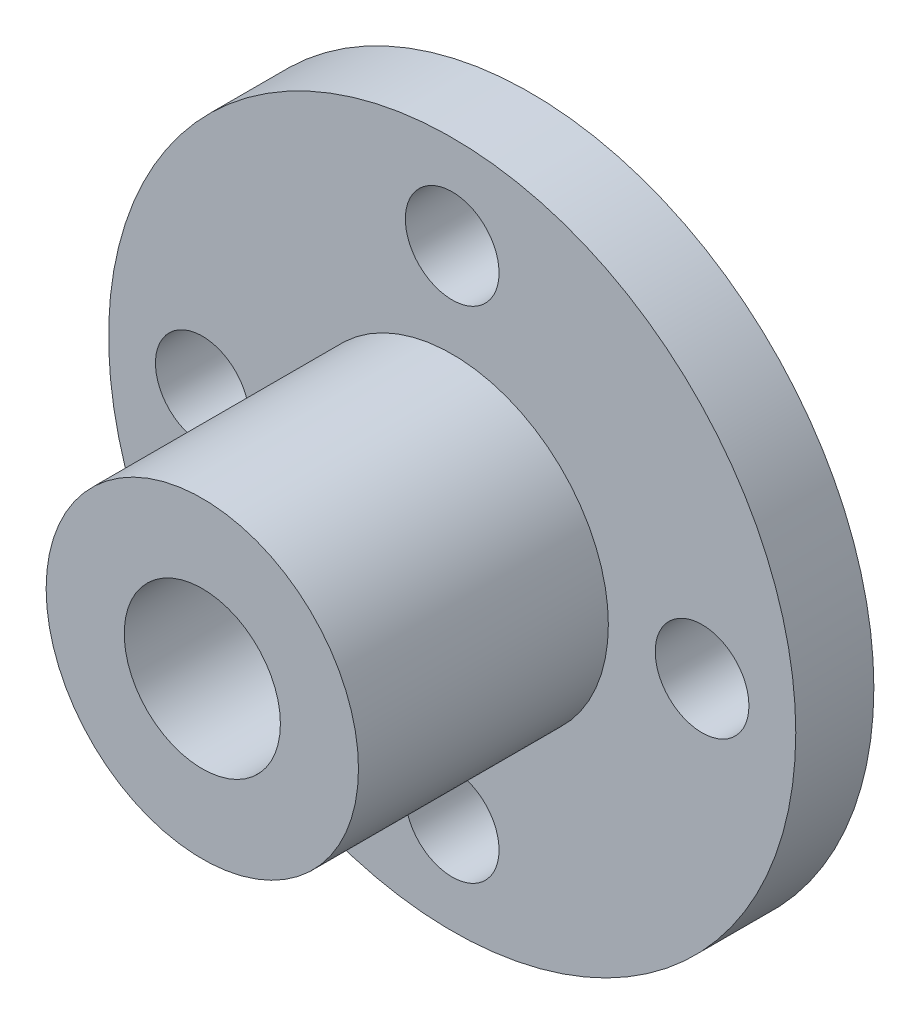
ISO-10303-21;
HEADER;
FILE_DESCRIPTION(('STEP AP214'),'2;1');
FILE_NAME('part.step','',(''),(''),'','','');
FILE_SCHEMA(('AUTOMOTIVE_DESIGN { 1 0 10303 214 1 1 1 1 }'));
ENDSEC;
DATA;
#1=APPLICATION_CONTEXT('core data for automotive mechanical design processes');
#2=APPLICATION_PROTOCOL_DEFINITION('international standard','automotive_design',2000,#1);
#3=PRODUCT_CONTEXT('',#1,'mechanical');
#4=PRODUCT('Part','Part','',(#3));
#5=PRODUCT_RELATED_PRODUCT_CATEGORY('part','',(#4));
#6=PRODUCT_DEFINITION_FORMATION('','',#4);
#7=PRODUCT_DEFINITION_CONTEXT('part definition',#1,'design');
#8=PRODUCT_DEFINITION('design','',#6,#7);
#9=PRODUCT_DEFINITION_SHAPE('','',#8);
#10=(LENGTH_UNIT() NAMED_UNIT(*) SI_UNIT(.MILLI.,.METRE.));
#11=(NAMED_UNIT(*) PLANE_ANGLE_UNIT() SI_UNIT($,.RADIAN.));
#12=(NAMED_UNIT(*) SI_UNIT($,.STERADIAN.) SOLID_ANGLE_UNIT());
#13=UNCERTAINTY_MEASURE_WITH_UNIT(LENGTH_MEASURE(1.E-05),#10,'distance_accuracy_value','');
#14=(GEOMETRIC_REPRESENTATION_CONTEXT(3) GLOBAL_UNCERTAINTY_ASSIGNED_CONTEXT((#13)) GLOBAL_UNIT_ASSIGNED_CONTEXT((#10,
#11,#12)) REPRESENTATION_CONTEXT('',''));
#15=CARTESIAN_POINT('',(0.,0.,0.));
#16=DIRECTION('',(0.,0.,1.));
#17=DIRECTION('',(1.,0.,0.));
#18=AXIS2_PLACEMENT_3D('',#15,#16,#17);
#19=CARTESIAN_POINT('',(0.,0.,2.5));
#20=DIRECTION('',(0.,0.,-1.));
#21=DIRECTION('',(-1.,0.,0.));
#22=AXIS2_PLACEMENT_3D('',#19,#20,#21);
#23=CYLINDRICAL_SURFACE('',#22,11.);
#24=CARTESIAN_POINT('',(0.,0.,2.5));
#25=DIRECTION('',(0.,0.,1.));
#26=DIRECTION('',(1.,0.,0.));
#27=AXIS2_PLACEMENT_3D('',#24,#25,#26);
#28=CIRCLE('',#27,11.);
#29=CARTESIAN_POINT('',(11.,0.,2.5));
#30=VERTEX_POINT('',#29);
#31=EDGE_CURVE('E46',#30,#30,#28,.T.);
#32=ORIENTED_EDGE('',*,*,#31,.F.);
#33=EDGE_LOOP('',(#32));
#34=FACE_BOUND('',#33,.T.);
#35=CARTESIAN_POINT('',(0.,0.,0.));
#36=DIRECTION('',(0.,0.,1.));
#37=DIRECTION('',(1.,0.,0.));
#38=AXIS2_PLACEMENT_3D('',#35,#36,#37);
#39=CIRCLE('',#38,11.);
#40=CARTESIAN_POINT('',(11.,0.,0.));
#41=VERTEX_POINT('',#40);
#42=EDGE_CURVE('E42',#41,#41,#39,.T.);
#43=ORIENTED_EDGE('',*,*,#42,.T.);
#44=EDGE_LOOP('',(#43));
#45=FACE_BOUND('',#44,.T.);
#46=ADVANCED_FACE('F39',(#34,#45),#23,.T.);
#47=CARTESIAN_POINT('',(0.,0.,2.5));
#48=DIRECTION('',(0.,0.,1.));
#49=DIRECTION('',(1.,0.,0.));
#50=AXIS2_PLACEMENT_3D('',#47,#48,#49);
#51=PLANE('',#50);
#52=CARTESIAN_POINT('',(8.,0.,2.5));
#53=DIRECTION('',(0.,0.,1.));
#54=DIRECTION('',(1.,0.,0.));
#55=AXIS2_PLACEMENT_3D('',#52,#53,#54);
#56=CIRCLE('',#55,1.5);
#57=CARTESIAN_POINT('',(9.5,0.,2.5));
#58=VERTEX_POINT('',#57);
#59=EDGE_CURVE('E78',#58,#58,#56,.T.);
#60=ORIENTED_EDGE('',*,*,#59,.F.);
#61=EDGE_LOOP('',(#60));
#62=FACE_BOUND('',#61,.T.);
#63=CARTESIAN_POINT('',(0.,-8.,2.5));
#64=DIRECTION('',(0.,0.,1.));
#65=DIRECTION('',(1.,0.,0.));
#66=AXIS2_PLACEMENT_3D('',#63,#64,#65);
#67=CIRCLE('',#66,1.5);
#68=CARTESIAN_POINT('',(1.49999999999997,-8.,2.5));
#69=VERTEX_POINT('',#68);
#70=EDGE_CURVE('E75',#69,#69,#67,.T.);
#71=ORIENTED_EDGE('',*,*,#70,.F.);
#72=EDGE_LOOP('',(#71));
#73=FACE_BOUND('',#72,.T.);
#74=CARTESIAN_POINT('',(-8.,0.,2.5));
#75=DIRECTION('',(0.,0.,1.));
#76=DIRECTION('',(1.,0.,0.));
#77=AXIS2_PLACEMENT_3D('',#74,#75,#76);
#78=CIRCLE('',#77,1.5);
#79=CARTESIAN_POINT('',(-6.5,0.,2.5));
#80=VERTEX_POINT('',#79);
#81=EDGE_CURVE('E69',#80,#80,#78,.T.);
#82=ORIENTED_EDGE('',*,*,#81,.F.);
#83=EDGE_LOOP('',(#82));
#84=FACE_BOUND('',#83,.T.);
#85=CARTESIAN_POINT('',(0.,8.,2.5));
#86=DIRECTION('',(0.,0.,1.));
#87=DIRECTION('',(1.,0.,0.));
#88=AXIS2_PLACEMENT_3D('',#85,#86,#87);
#89=CIRCLE('',#88,1.5);
#90=CARTESIAN_POINT('',(1.50000000000008,8.,2.5));
#91=VERTEX_POINT('',#90);
#92=EDGE_CURVE('E62',#91,#91,#89,.T.);
#93=ORIENTED_EDGE('',*,*,#92,.F.);
#94=EDGE_LOOP('',(#93));
#95=FACE_BOUND('',#94,.T.);
#96=CARTESIAN_POINT('',(0.,0.,2.5));
#97=DIRECTION('',(0.,0.,1.));
#98=DIRECTION('',(1.,0.,0.));
#99=AXIS2_PLACEMENT_3D('',#96,#97,#98);
#100=CIRCLE('',#99,5.);
#101=CARTESIAN_POINT('',(5.,0.,2.5));
#102=VERTEX_POINT('',#101);
#103=EDGE_CURVE('E10',#102,#102,#100,.T.);
#104=ORIENTED_EDGE('',*,*,#103,.F.);
#105=EDGE_LOOP('',(#104));
#106=FACE_BOUND('',#105,.T.);
#107=ORIENTED_EDGE('',*,*,#31,.T.);
#108=EDGE_LOOP('',(#107));
#109=FACE_BOUND('',#108,.T.);
#110=ADVANCED_FACE('F89',(#62,#73,#84,#95,#106,#109),#51,.T.);
#111=CARTESIAN_POINT('',(0.,0.,0.));
#112=DIRECTION('',(0.,0.,1.));
#113=DIRECTION('',(1.,0.,0.));
#114=AXIS2_PLACEMENT_3D('',#111,#112,#113);
#115=PLANE('',#114);
#116=CARTESIAN_POINT('',(8.,0.,0.));
#117=DIRECTION('',(0.,0.,1.));
#118=DIRECTION('',(1.,0.,0.));
#119=AXIS2_PLACEMENT_3D('',#116,#117,#118);
#120=CIRCLE('',#119,1.5);
#121=CARTESIAN_POINT('',(9.5,0.,0.));
#122=VERTEX_POINT('',#121);
#123=EDGE_CURVE('E61',#122,#122,#120,.F.);
#124=ORIENTED_EDGE('',*,*,#123,.F.);
#125=EDGE_LOOP('',(#124));
#126=FACE_BOUND('',#125,.T.);
#127=CARTESIAN_POINT('',(0.,-8.,0.));
#128=DIRECTION('',(0.,0.,1.));
#129=DIRECTION('',(1.,0.,0.));
#130=AXIS2_PLACEMENT_3D('',#127,#128,#129);
#131=CIRCLE('',#130,1.5);
#132=CARTESIAN_POINT('',(1.49999999999997,-8.,0.));
#133=VERTEX_POINT('',#132);
#134=EDGE_CURVE('E72',#133,#133,#131,.F.);
#135=ORIENTED_EDGE('',*,*,#134,.F.);
#136=EDGE_LOOP('',(#135));
#137=FACE_BOUND('',#136,.T.);
#138=CARTESIAN_POINT('',(-8.,0.,0.));
#139=DIRECTION('',(0.,0.,1.));
#140=DIRECTION('',(1.,0.,0.));
#141=AXIS2_PLACEMENT_3D('',#138,#139,#140);
#142=CIRCLE('',#141,1.5);
#143=CARTESIAN_POINT('',(-6.5,0.,0.));
#144=VERTEX_POINT('',#143);
#145=EDGE_CURVE('E65',#144,#144,#142,.F.);
#146=ORIENTED_EDGE('',*,*,#145,.F.);
#147=EDGE_LOOP('',(#146));
#148=FACE_BOUND('',#147,.T.);
#149=CARTESIAN_POINT('',(0.,8.,0.));
#150=DIRECTION('',(0.,0.,1.));
#151=DIRECTION('',(1.,0.,0.));
#152=AXIS2_PLACEMENT_3D('',#149,#150,#151);
#153=CIRCLE('',#152,1.5);
#154=CARTESIAN_POINT('',(1.50000000000008,8.,0.));
#155=VERTEX_POINT('',#154);
#156=EDGE_CURVE('E66',#155,#155,#153,.F.);
#157=ORIENTED_EDGE('',*,*,#156,.F.);
#158=EDGE_LOOP('',(#157));
#159=FACE_BOUND('',#158,.T.);
#160=CARTESIAN_POINT('',(0.,0.,0.));
#161=DIRECTION('',(0.,0.,1.));
#162=DIRECTION('',(1.,0.,0.));
#163=AXIS2_PLACEMENT_3D('',#160,#161,#162);
#164=CIRCLE('',#163,2.5);
#165=CARTESIAN_POINT('',(2.5,0.,0.));
#166=VERTEX_POINT('',#165);
#167=EDGE_CURVE('E55',#166,#166,#164,.F.);
#168=ORIENTED_EDGE('',*,*,#167,.F.);
#169=EDGE_LOOP('',(#168));
#170=FACE_BOUND('',#169,.T.);
#171=ORIENTED_EDGE('',*,*,#42,.F.);
#172=EDGE_LOOP('',(#171));
#173=FACE_BOUND('',#172,.T.);
#174=ADVANCED_FACE('F92',(#126,#137,#148,#159,#170,#173),#115,.F.);
#175=CARTESIAN_POINT('',(0.,0.,10.5));
#176=DIRECTION('',(0.,0.,-1.));
#177=DIRECTION('',(-1.,0.,0.));
#178=AXIS2_PLACEMENT_3D('',#175,#176,#177);
#179=CYLINDRICAL_SURFACE('',#178,5.);
#180=CARTESIAN_POINT('',(0.,0.,10.5));
#181=DIRECTION('',(0.,0.,1.));
#182=DIRECTION('',(1.,0.,0.));
#183=AXIS2_PLACEMENT_3D('',#180,#181,#182);
#184=CIRCLE('',#183,5.);
#185=CARTESIAN_POINT('',(5.,0.,10.5));
#186=VERTEX_POINT('',#185);
#187=EDGE_CURVE('E52',#186,#186,#184,.T.);
#188=ORIENTED_EDGE('',*,*,#187,.F.);
#189=EDGE_LOOP('',(#188));
#190=FACE_BOUND('',#189,.T.);
#191=ORIENTED_EDGE('',*,*,#103,.T.);
#192=EDGE_LOOP('',(#191));
#193=FACE_BOUND('',#192,.T.);
#194=ADVANCED_FACE('F109',(#190,#193),#179,.T.);
#195=CARTESIAN_POINT('',(0.,0.,10.5));
#196=DIRECTION('',(0.,0.,1.));
#197=DIRECTION('',(1.,0.,0.));
#198=AXIS2_PLACEMENT_3D('',#195,#196,#197);
#199=PLANE('',#198);
#200=CARTESIAN_POINT('',(0.,0.,10.5));
#201=DIRECTION('',(0.,0.,1.));
#202=DIRECTION('',(1.,0.,0.));
#203=AXIS2_PLACEMENT_3D('',#200,#201,#202);
#204=CIRCLE('',#203,2.5);
#205=CARTESIAN_POINT('',(2.5,0.,10.5));
#206=VERTEX_POINT('',#205);
#207=EDGE_CURVE('E58',#206,#206,#204,.T.);
#208=ORIENTED_EDGE('',*,*,#207,.F.);
#209=EDGE_LOOP('',(#208));
#210=FACE_BOUND('',#209,.T.);
#211=ORIENTED_EDGE('',*,*,#187,.T.);
#212=EDGE_LOOP('',(#211));
#213=FACE_BOUND('',#212,.T.);
#214=ADVANCED_FACE('F115',(#210,#213),#199,.T.);
#215=CARTESIAN_POINT('',(0.,0.,-0.000999999999999265));
#216=DIRECTION('',(0.,0.,1.));
#217=DIRECTION('',(1.,0.,0.));
#218=AXIS2_PLACEMENT_3D('',#215,#216,#217);
#219=CYLINDRICAL_SURFACE('',#218,2.5);
#220=ORIENTED_EDGE('',*,*,#207,.T.);
#221=EDGE_LOOP('',(#220));
#222=FACE_BOUND('',#221,.T.);
#223=ORIENTED_EDGE('',*,*,#167,.T.);
#224=EDGE_LOOP('',(#223));
#225=FACE_BOUND('',#224,.T.);
#226=ADVANCED_FACE('F123',(#222,#225),#219,.F.);
#227=CARTESIAN_POINT('',(0.,8.,-0.00100000000000013));
#228=DIRECTION('',(0.,0.,1.));
#229=DIRECTION('',(1.,0.,0.));
#230=AXIS2_PLACEMENT_3D('',#227,#228,#229);
#231=CYLINDRICAL_SURFACE('',#230,1.5);
#232=ORIENTED_EDGE('',*,*,#92,.T.);
#233=EDGE_LOOP('',(#232));
#234=FACE_BOUND('',#233,.T.);
#235=ORIENTED_EDGE('',*,*,#156,.T.);
#236=EDGE_LOOP('',(#235));
#237=FACE_BOUND('',#236,.T.);
#238=ADVANCED_FACE('F127',(#234,#237),#231,.F.);
#239=CARTESIAN_POINT('',(-8.,0.,-0.00100000000000013));
#240=DIRECTION('',(0.,0.,1.));
#241=DIRECTION('',(1.,0.,0.));
#242=AXIS2_PLACEMENT_3D('',#239,#240,#241);
#243=CYLINDRICAL_SURFACE('',#242,1.5);
#244=ORIENTED_EDGE('',*,*,#81,.T.);
#245=EDGE_LOOP('',(#244));
#246=FACE_BOUND('',#245,.T.);
#247=ORIENTED_EDGE('',*,*,#145,.T.);
#248=EDGE_LOOP('',(#247));
#249=FACE_BOUND('',#248,.T.);
#250=ADVANCED_FACE('F130',(#246,#249),#243,.F.);
#251=CARTESIAN_POINT('',(0.,-8.,-0.00100000000000013));
#252=DIRECTION('',(0.,0.,1.));
#253=DIRECTION('',(1.,0.,0.));
#254=AXIS2_PLACEMENT_3D('',#251,#252,#253);
#255=CYLINDRICAL_SURFACE('',#254,1.5);
#256=ORIENTED_EDGE('',*,*,#70,.T.);
#257=EDGE_LOOP('',(#256));
#258=FACE_BOUND('',#257,.T.);
#259=ORIENTED_EDGE('',*,*,#134,.T.);
#260=EDGE_LOOP('',(#259));
#261=FACE_BOUND('',#260,.T.);
#262=ADVANCED_FACE('F134',(#258,#261),#255,.F.);
#263=CARTESIAN_POINT('',(8.,0.,-0.00100000000000013));
#264=DIRECTION('',(0.,0.,1.));
#265=DIRECTION('',(1.,0.,0.));
#266=AXIS2_PLACEMENT_3D('',#263,#264,#265);
#267=CYLINDRICAL_SURFACE('',#266,1.5);
#268=ORIENTED_EDGE('',*,*,#59,.T.);
#269=EDGE_LOOP('',(#268));
#270=FACE_BOUND('',#269,.T.);
#271=ORIENTED_EDGE('',*,*,#123,.T.);
#272=EDGE_LOOP('',(#271));
#273=FACE_BOUND('',#272,.T.);
#274=ADVANCED_FACE('F86',(#270,#273),#267,.F.);
#275=CLOSED_SHELL('',(#46,#110,#174,#194,#214,#226,#238,#250,#262,#274));
#276=MANIFOLD_SOLID_BREP('B2',#275);
#277=ADVANCED_BREP_SHAPE_REPRESENTATION('',(#18,#276),#14);
#278=SHAPE_DEFINITION_REPRESENTATION(#9,#277);
ENDSEC;
END-ISO-10303-21;
